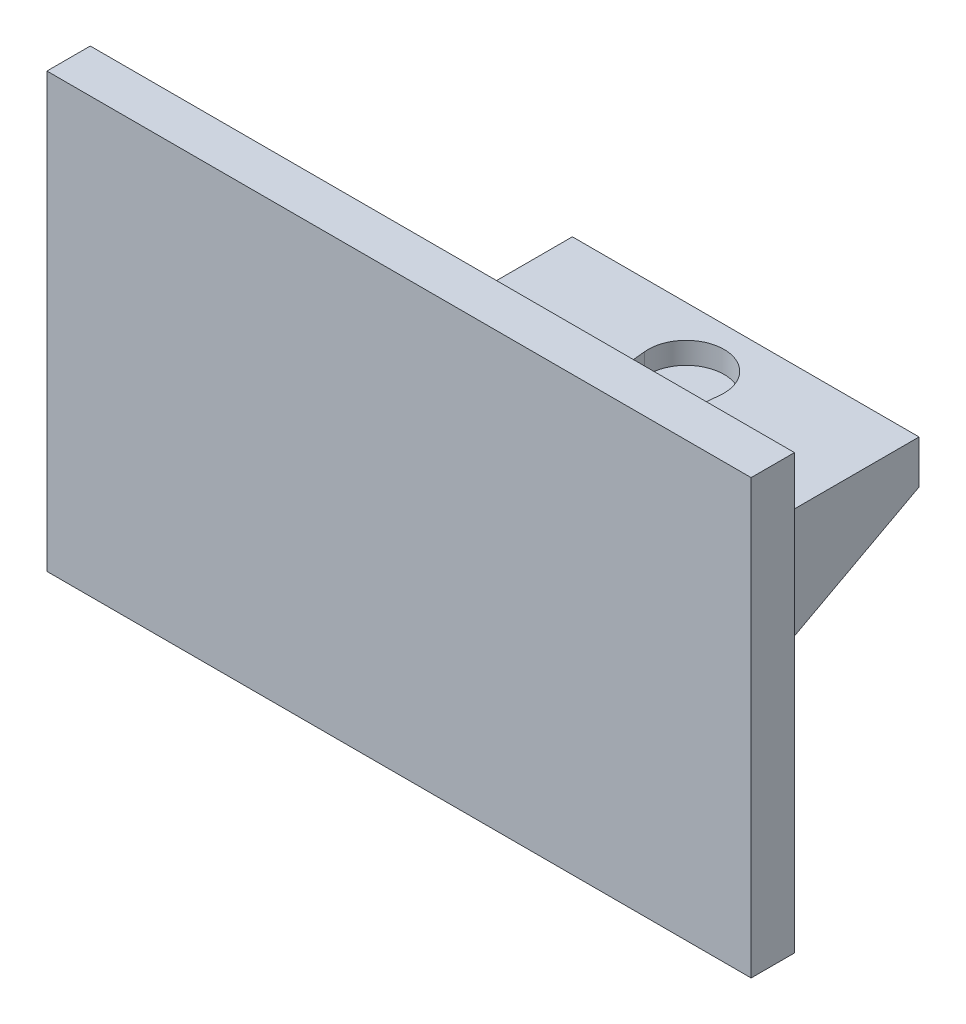
ISO-10303-21;
HEADER;
FILE_DESCRIPTION(('STEP AP214'),'2;1');
FILE_NAME('part.step','',(''),(''),'','','');
FILE_SCHEMA(('AUTOMOTIVE_DESIGN { 1 0 10303 214 1 1 1 1 }'));
ENDSEC;
DATA;
#1=APPLICATION_CONTEXT('core data for automotive mechanical design processes');
#2=APPLICATION_PROTOCOL_DEFINITION('international standard','automotive_design',2000,#1);
#3=PRODUCT_CONTEXT('',#1,'mechanical');
#4=PRODUCT('Part','Part','',(#3));
#5=PRODUCT_RELATED_PRODUCT_CATEGORY('part','',(#4));
#6=PRODUCT_DEFINITION_FORMATION('','',#4);
#7=PRODUCT_DEFINITION_CONTEXT('part definition',#1,'design');
#8=PRODUCT_DEFINITION('design','',#6,#7);
#9=PRODUCT_DEFINITION_SHAPE('','',#8);
#10=(LENGTH_UNIT() NAMED_UNIT(*) SI_UNIT(.MILLI.,.METRE.));
#11=(NAMED_UNIT(*) PLANE_ANGLE_UNIT() SI_UNIT($,.RADIAN.));
#12=(NAMED_UNIT(*) SI_UNIT($,.STERADIAN.) SOLID_ANGLE_UNIT());
#13=UNCERTAINTY_MEASURE_WITH_UNIT(LENGTH_MEASURE(1.E-05),#10,'distance_accuracy_value','');
#14=(GEOMETRIC_REPRESENTATION_CONTEXT(3) GLOBAL_UNCERTAINTY_ASSIGNED_CONTEXT((#13)) GLOBAL_UNIT_ASSIGNED_CONTEXT((#10,
#11,#12)) REPRESENTATION_CONTEXT('',''));
#15=CARTESIAN_POINT('',(0.,0.,0.));
#16=DIRECTION('',(0.,0.,1.));
#17=DIRECTION('',(1.,0.,0.));
#18=AXIS2_PLACEMENT_3D('',#15,#16,#17);
#19=CARTESIAN_POINT('',(0.,4.,4.5));
#20=DIRECTION('',(0.,-1.,0.));
#21=DIRECTION('',(0.,0.,-1.));
#22=AXIS2_PLACEMENT_3D('',#19,#20,#21);
#23=CYLINDRICAL_SURFACE('',#22,2.);
#24=CARTESIAN_POINT('',(0.,2.,4.5));
#25=DIRECTION('',(0.,1.,0.));
#26=DIRECTION('',(0.,0.,1.));
#27=AXIS2_PLACEMENT_3D('',#24,#25,#26);
#28=CIRCLE('',#27,2.);
#29=CARTESIAN_POINT('',(-1.98997487421325,2.,4.70000000000002));
#30=VERTEX_POINT('',#29);
#31=CARTESIAN_POINT('',(1.98997487421324,2.,4.70000000000002));
#32=VERTEX_POINT('',#31);
#33=EDGE_CURVE('E64',#30,#32,#28,.T.);
#34=ORIENTED_EDGE('',*,*,#33,.F.);
#35=DIRECTION('',(0.,-1.,0.));
#36=VECTOR('',#35,1.);
#37=CARTESIAN_POINT('',(-1.98997487421324,4.,4.70000000000002));
#38=LINE('',#37,#36);
#39=CARTESIAN_POINT('',(-1.98997487421324,4.,4.70000000000002));
#40=VERTEX_POINT('',#39);
#41=EDGE_CURVE('E135',#40,#30,#38,.T.);
#42=ORIENTED_EDGE('',*,*,#41,.F.);
#43=CARTESIAN_POINT('',(0.,4.,4.5));
#44=DIRECTION('',(0.,1.,0.));
#45=DIRECTION('',(0.,0.,1.));
#46=AXIS2_PLACEMENT_3D('',#43,#44,#45);
#47=CIRCLE('',#46,2.);
#48=CARTESIAN_POINT('',(1.98997487421324,4.,4.70000000000002));
#49=VERTEX_POINT('',#48);
#50=EDGE_CURVE('E116',#40,#49,#47,.T.);
#51=ORIENTED_EDGE('',*,*,#50,.T.);
#52=DIRECTION('',(0.,-1.,0.));
#53=VECTOR('',#52,1.);
#54=CARTESIAN_POINT('',(1.98997487421324,4.,4.70000000000002));
#55=LINE('',#54,#53);
#56=EDGE_CURVE('E125',#49,#32,#55,.T.);
#57=ORIENTED_EDGE('',*,*,#56,.T.);
#58=EDGE_LOOP('',(#34,#42,#51,#57));
#59=FACE_BOUND('',#58,.T.);
#60=ADVANCED_FACE('F49',(#59),#23,.F.);
#61=CARTESIAN_POINT('',(-2.43771922091122,4.,0.245));
#62=DIRECTION('',(0.99498743710662,0.,-0.1));
#63=DIRECTION('',(-0.1,0.,-0.99498743710662));
#64=AXIS2_PLACEMENT_3D('',#61,#62,#63);
#65=PLANE('',#64);
#66=DIRECTION('',(0.1,0.,0.99498743710662));
#67=VECTOR('',#66,1.);
#68=CARTESIAN_POINT('',(-2.43771922091122,2.,0.245));
#69=LINE('',#68,#67);
#70=CARTESIAN_POINT('',(-3.48245602987318,2.,-10.15));
#71=VERTEX_POINT('',#70);
#72=EDGE_CURVE('E96',#71,#30,#69,.T.);
#73=ORIENTED_EDGE('',*,*,#72,.F.);
#74=DIRECTION('',(0.,-1.,0.));
#75=VECTOR('',#74,1.);
#76=CARTESIAN_POINT('',(-3.48245602987317,4.,-10.15));
#77=LINE('',#76,#75);
#78=CARTESIAN_POINT('',(-3.48245602987317,4.,-10.15));
#79=VERTEX_POINT('',#78);
#80=EDGE_CURVE('E171',#79,#71,#77,.T.);
#81=ORIENTED_EDGE('',*,*,#80,.F.);
#82=DIRECTION('',(0.1,0.,0.99498743710662));
#83=VECTOR('',#82,1.);
#84=CARTESIAN_POINT('',(-2.43771922091122,4.,0.245));
#85=LINE('',#84,#83);
#86=EDGE_CURVE('E137',#79,#40,#85,.T.);
#87=ORIENTED_EDGE('',*,*,#86,.T.);
#88=ORIENTED_EDGE('',*,*,#41,.T.);
#89=EDGE_LOOP('',(#73,#81,#87,#88));
#90=FACE_BOUND('',#89,.T.);
#91=ADVANCED_FACE('F402',(#90),#65,.T.);
#92=CARTESIAN_POINT('',(0.,4.,-10.5));
#93=DIRECTION('',(0.,-1.,0.));
#94=DIRECTION('',(0.,0.,-1.));
#95=AXIS2_PLACEMENT_3D('',#92,#93,#94);
#96=CYLINDRICAL_SURFACE('',#95,3.5);
#97=CARTESIAN_POINT('',(0.,2.,-10.5));
#98=DIRECTION('',(0.,1.,0.));
#99=DIRECTION('',(0.,0.,1.));
#100=AXIS2_PLACEMENT_3D('',#97,#98,#99);
#101=CIRCLE('',#100,3.5);
#102=CARTESIAN_POINT('',(3.48245602987316,2.,-10.15));
#103=VERTEX_POINT('',#102);
#104=EDGE_CURVE('E291',#103,#71,#101,.T.);
#105=ORIENTED_EDGE('',*,*,#104,.F.);
#106=DIRECTION('',(0.,-1.,0.));
#107=VECTOR('',#106,1.);
#108=CARTESIAN_POINT('',(3.48245602987317,4.,-10.15));
#109=LINE('',#108,#107);
#110=CARTESIAN_POINT('',(3.48245602987317,4.,-10.15));
#111=VERTEX_POINT('',#110);
#112=EDGE_CURVE('E130',#111,#103,#109,.T.);
#113=ORIENTED_EDGE('',*,*,#112,.F.);
#114=CARTESIAN_POINT('',(0.,4.,-10.5));
#115=DIRECTION('',(0.,1.,0.));
#116=DIRECTION('',(0.,0.,1.));
#117=AXIS2_PLACEMENT_3D('',#114,#115,#116);
#118=CIRCLE('',#117,3.5);
#119=EDGE_CURVE('E118',#111,#79,#118,.T.);
#120=ORIENTED_EDGE('',*,*,#119,.T.);
#121=ORIENTED_EDGE('',*,*,#80,.T.);
#122=EDGE_LOOP('',(#105,#113,#120,#121));
#123=FACE_BOUND('',#122,.T.);
#124=ADVANCED_FACE('F400',(#123),#96,.F.);
#125=CARTESIAN_POINT('',(2.43771922091122,4.,0.245));
#126=DIRECTION('',(0.99498743710662,0.,0.1));
#127=DIRECTION('',(0.1,0.,-0.99498743710662));
#128=AXIS2_PLACEMENT_3D('',#125,#126,#127);
#129=PLANE('',#128);
#130=ORIENTED_EDGE('',*,*,#112,.T.);
#131=DIRECTION('',(-0.1,0.,0.99498743710662));
#132=VECTOR('',#131,1.);
#133=CARTESIAN_POINT('',(2.43771922091122,2.,0.245));
#134=LINE('',#133,#132);
#135=EDGE_CURVE('E127',#103,#32,#134,.T.);
#136=ORIENTED_EDGE('',*,*,#135,.T.);
#137=ORIENTED_EDGE('',*,*,#56,.F.);
#138=DIRECTION('',(-0.1,0.,0.99498743710662));
#139=VECTOR('',#138,1.);
#140=CARTESIAN_POINT('',(2.43771922091122,4.,0.245));
#141=LINE('',#140,#139);
#142=EDGE_CURVE('E110',#111,#49,#141,.T.);
#143=ORIENTED_EDGE('',*,*,#142,.F.);
#144=EDGE_LOOP('',(#130,#136,#137,#143));
#145=FACE_BOUND('',#144,.T.);
#146=ADVANCED_FACE('F126',(#145),#129,.F.);
#147=CARTESIAN_POINT('',(0.,4.,-16.));
#148=DIRECTION('',(0.,0.,-1.));
#149=DIRECTION('',(-1.,0.,0.));
#150=AXIS2_PLACEMENT_3D('',#147,#148,#149);
#151=PLANE('',#150);
#152=DIRECTION('',(-1.,0.,0.));
#153=VECTOR('',#152,1.);
#154=CARTESIAN_POINT('',(32.5,0.,-16.));
#155=LINE('',#154,#153);
#156=CARTESIAN_POINT('',(-12.,0.,-16.));
#157=VERTEX_POINT('',#156);
#158=CARTESIAN_POINT('',(-16.,0.,-16.));
#159=VERTEX_POINT('',#158);
#160=EDGE_CURVE('E478',#157,#159,#155,.T.);
#161=ORIENTED_EDGE('',*,*,#160,.T.);
#162=DIRECTION('',(0.,1.,0.));
#163=VECTOR('',#162,1.);
#164=CARTESIAN_POINT('',(-16.,-15.,-16.));
#165=LINE('',#164,#163);
#166=CARTESIAN_POINT('',(-16.,4.,-16.));
#167=VERTEX_POINT('',#166);
#168=EDGE_CURVE('E272',#159,#167,#165,.T.);
#169=ORIENTED_EDGE('',*,*,#168,.T.);
#170=DIRECTION('',(1.,0.,0.));
#171=VECTOR('',#170,1.);
#172=CARTESIAN_POINT('',(0.,4.,-16.));
#173=LINE('',#172,#171);
#174=CARTESIAN_POINT('',(16.,4.,-16.));
#175=VERTEX_POINT('',#174);
#176=EDGE_CURVE('E131',#167,#175,#173,.T.);
#177=ORIENTED_EDGE('',*,*,#176,.T.);
#178=DIRECTION('',(0.,1.,0.));
#179=VECTOR('',#178,1.);
#180=CARTESIAN_POINT('',(16.,-15.,-16.));
#181=LINE('',#180,#179);
#182=CARTESIAN_POINT('',(16.,0.,-16.));
#183=VERTEX_POINT('',#182);
#184=EDGE_CURVE('E234',#183,#175,#181,.T.);
#185=ORIENTED_EDGE('',*,*,#184,.F.);
#186=CARTESIAN_POINT('',(12.,0.,-16.));
#187=VERTEX_POINT('',#186);
#188=EDGE_CURVE('E483',#183,#187,#155,.T.);
#189=ORIENTED_EDGE('',*,*,#188,.T.);
#190=DIRECTION('',(1.,0.,0.));
#191=VECTOR('',#190,1.);
#192=CARTESIAN_POINT('',(0.,0.,-16.));
#193=LINE('',#192,#191);
#194=EDGE_CURVE('E138',#157,#187,#193,.T.);
#195=ORIENTED_EDGE('',*,*,#194,.F.);
#196=EDGE_LOOP('',(#161,#169,#177,#185,#189,#195));
#197=FACE_BOUND('',#196,.T.);
#198=ADVANCED_FACE('F413',(#197),#151,.T.);
#199=CARTESIAN_POINT('',(0.,4.,0.));
#200=DIRECTION('',(0.,1.,0.));
#201=DIRECTION('',(0.,0.,1.));
#202=AXIS2_PLACEMENT_3D('',#199,#200,#201);
#203=PLANE('',#202);
#204=ORIENTED_EDGE('',*,*,#50,.F.);
#205=ORIENTED_EDGE('',*,*,#86,.F.);
#206=ORIENTED_EDGE('',*,*,#119,.F.);
#207=ORIENTED_EDGE('',*,*,#142,.T.);
#208=EDGE_LOOP('',(#204,#205,#206,#207));
#209=FACE_BOUND('',#208,.T.);
#210=DIRECTION('',(-1.,0.,0.));
#211=VECTOR('',#210,1.);
#212=CARTESIAN_POINT('',(32.5,4.,4.50000000000002));
#213=LINE('',#212,#211);
#214=CARTESIAN_POINT('',(-12.,4.,4.50000000000002));
#215=VERTEX_POINT('',#214);
#216=CARTESIAN_POINT('',(-16.,4.,4.50000000000002));
#217=VERTEX_POINT('',#216);
#218=EDGE_CURVE('E529',#215,#217,#213,.T.);
#219=ORIENTED_EDGE('',*,*,#218,.F.);
#220=DIRECTION('',(0.,0.,1.));
#221=VECTOR('',#220,1.);
#222=CARTESIAN_POINT('',(-12.,4.,0.));
#223=LINE('',#222,#221);
#224=CARTESIAN_POINT('',(-12.,4.,12.));
#225=VERTEX_POINT('',#224);
#226=EDGE_CURVE('E122',#215,#225,#223,.T.);
#227=ORIENTED_EDGE('',*,*,#226,.T.);
#228=DIRECTION('',(1.,0.,0.));
#229=VECTOR('',#228,1.);
#230=CARTESIAN_POINT('',(0.,4.,12.));
#231=LINE('',#230,#229);
#232=CARTESIAN_POINT('',(12.,4.,12.));
#233=VERTEX_POINT('',#232);
#234=EDGE_CURVE('E154',#225,#233,#231,.T.);
#235=ORIENTED_EDGE('',*,*,#234,.T.);
#236=DIRECTION('',(0.,0.,1.));
#237=VECTOR('',#236,1.);
#238=CARTESIAN_POINT('',(12.,4.,0.));
#239=LINE('',#238,#237);
#240=CARTESIAN_POINT('',(12.,4.,4.50000000000002));
#241=VERTEX_POINT('',#240);
#242=EDGE_CURVE('E73',#241,#233,#239,.T.);
#243=ORIENTED_EDGE('',*,*,#242,.F.);
#244=CARTESIAN_POINT('',(16.,4.,4.50000000000002));
#245=VERTEX_POINT('',#244);
#246=EDGE_CURVE('E475',#245,#241,#213,.T.);
#247=ORIENTED_EDGE('',*,*,#246,.F.);
#248=DIRECTION('',(0.,0.,1.));
#249=VECTOR('',#248,1.);
#250=CARTESIAN_POINT('',(16.,4.,0.));
#251=LINE('',#250,#249);
#252=EDGE_CURVE('E527',#175,#245,#251,.T.);
#253=ORIENTED_EDGE('',*,*,#252,.F.);
#254=ORIENTED_EDGE('',*,*,#176,.F.);
#255=DIRECTION('',(0.,0.,1.));
#256=VECTOR('',#255,1.);
#257=CARTESIAN_POINT('',(-16.,4.,0.));
#258=LINE('',#257,#256);
#259=EDGE_CURVE('E514',#167,#217,#258,.T.);
#260=ORIENTED_EDGE('',*,*,#259,.T.);
#261=EDGE_LOOP('',(#219,#227,#235,#243,#247,#253,#254,#260));
#262=FACE_BOUND('',#261,.T.);
#263=ADVANCED_FACE('F112',(#209,#262),#203,.T.);
#264=CARTESIAN_POINT('',(0.,0.,0.));
#265=DIRECTION('',(0.,1.,0.));
#266=DIRECTION('',(0.,0.,1.));
#267=AXIS2_PLACEMENT_3D('',#264,#265,#266);
#268=PLANE('',#267);
#269=DIRECTION('',(0.,0.,1.));
#270=VECTOR('',#269,1.);
#271=CARTESIAN_POINT('',(-12.,0.,0.));
#272=LINE('',#271,#270);
#273=CARTESIAN_POINT('',(-12.,0.,12.));
#274=VERTEX_POINT('',#273);
#275=EDGE_CURVE('E162',#157,#274,#272,.T.);
#276=ORIENTED_EDGE('',*,*,#275,.F.);
#277=ORIENTED_EDGE('',*,*,#194,.T.);
#278=DIRECTION('',(0.,0.,1.));
#279=VECTOR('',#278,1.);
#280=CARTESIAN_POINT('',(12.,0.,0.));
#281=LINE('',#280,#279);
#282=CARTESIAN_POINT('',(12.,0.,12.));
#283=VERTEX_POINT('',#282);
#284=EDGE_CURVE('E144',#187,#283,#281,.T.);
#285=ORIENTED_EDGE('',*,*,#284,.T.);
#286=DIRECTION('',(1.,0.,0.));
#287=VECTOR('',#286,1.);
#288=CARTESIAN_POINT('',(0.,0.,12.));
#289=LINE('',#288,#287);
#290=EDGE_CURVE('E87',#274,#283,#289,.T.);
#291=ORIENTED_EDGE('',*,*,#290,.F.);
#292=EDGE_LOOP('',(#276,#277,#285,#291));
#293=FACE_BOUND('',#292,.T.);
#294=CARTESIAN_POINT('',(0.,0.,2.5));
#295=DIRECTION('',(0.,1.,0.));
#296=DIRECTION('',(0.,0.,1.));
#297=AXIS2_PLACEMENT_3D('',#294,#295,#296);
#298=CIRCLE('',#297,0.5);
#299=CARTESIAN_POINT('',(0.,0.,3.));
#300=VERTEX_POINT('',#299);
#301=EDGE_CURVE('E147',#300,#300,#298,.T.);
#302=ORIENTED_EDGE('',*,*,#301,.T.);
#303=EDGE_LOOP('',(#302));
#304=FACE_BOUND('',#303,.T.);
#305=ADVANCED_FACE('F417',(#293,#304),#268,.F.);
#306=CARTESIAN_POINT('',(0.,2.,2.5));
#307=DIRECTION('',(0.,-1.,0.));
#308=DIRECTION('',(0.,0.,-1.));
#309=AXIS2_PLACEMENT_3D('',#306,#307,#308);
#310=CYLINDRICAL_SURFACE('',#309,0.5);
#311=CARTESIAN_POINT('',(0.,2.,2.5));
#312=DIRECTION('',(0.,1.,0.));
#313=DIRECTION('',(0.,0.,1.));
#314=AXIS2_PLACEMENT_3D('',#311,#312,#313);
#315=CIRCLE('',#314,0.5);
#316=CARTESIAN_POINT('',(0.,2.,3.));
#317=VERTEX_POINT('',#316);
#318=EDGE_CURVE('E283',#317,#317,#315,.T.);
#319=ORIENTED_EDGE('',*,*,#318,.T.);
#320=EDGE_LOOP('',(#319));
#321=FACE_BOUND('',#320,.T.);
#322=ORIENTED_EDGE('',*,*,#301,.F.);
#323=EDGE_LOOP('',(#322));
#324=FACE_BOUND('',#323,.T.);
#325=ADVANCED_FACE('F420',(#321,#324),#310,.F.);
#326=CARTESIAN_POINT('',(0.,2.,0.));
#327=DIRECTION('',(0.,1.,0.));
#328=DIRECTION('',(0.,0.,1.));
#329=AXIS2_PLACEMENT_3D('',#326,#327,#328);
#330=PLANE('',#329);
#331=ORIENTED_EDGE('',*,*,#318,.F.);
#332=EDGE_LOOP('',(#331));
#333=FACE_BOUND('',#332,.T.);
#334=ORIENTED_EDGE('',*,*,#33,.T.);
#335=ORIENTED_EDGE('',*,*,#135,.F.);
#336=ORIENTED_EDGE('',*,*,#104,.T.);
#337=ORIENTED_EDGE('',*,*,#72,.T.);
#338=EDGE_LOOP('',(#334,#335,#336,#337));
#339=FACE_BOUND('',#338,.T.);
#340=ADVANCED_FACE('F398',(#333,#339),#330,.T.);
#341=CARTESIAN_POINT('',(12.,-15.,0.));
#342=DIRECTION('',(-1.,0.,0.));
#343=DIRECTION('',(0.,0.,1.));
#344=AXIS2_PLACEMENT_3D('',#341,#342,#343);
#345=PLANE('',#344);
#346=DIRECTION('',(0.,0.472221412515419,-0.881479970028782));
#347=VECTOR('',#346,1.);
#348=CARTESIAN_POINT('',(12.,-10.0049554013875,2.67591674925669));
#349=LINE('',#348,#347);
#350=CARTESIAN_POINT('',(12.,-15.,12.));
#351=VERTEX_POINT('',#350);
#352=EDGE_CURVE('E316',#351,#187,#349,.T.);
#353=ORIENTED_EDGE('',*,*,#352,.F.);
#354=DIRECTION('',(0.,1.,0.));
#355=VECTOR('',#354,1.);
#356=CARTESIAN_POINT('',(12.,-15.,12.));
#357=LINE('',#356,#355);
#358=EDGE_CURVE('E246',#351,#283,#357,.T.);
#359=ORIENTED_EDGE('',*,*,#358,.T.);
#360=ORIENTED_EDGE('',*,*,#284,.F.);
#361=EDGE_LOOP('',(#353,#359,#360));
#362=FACE_BOUND('',#361,.T.);
#363=ADVANCED_FACE('F428',(#362),#345,.T.);
#364=CARTESIAN_POINT('',(-12.,-15.,0.));
#365=DIRECTION('',(-1.,0.,0.));
#366=DIRECTION('',(0.,0.,1.));
#367=AXIS2_PLACEMENT_3D('',#364,#365,#366);
#368=PLANE('',#367);
#369=DIRECTION('',(0.,1.,0.));
#370=VECTOR('',#369,1.);
#371=CARTESIAN_POINT('',(-12.,-15.,12.));
#372=LINE('',#371,#370);
#373=CARTESIAN_POINT('',(-12.,-15.,12.));
#374=VERTEX_POINT('',#373);
#375=EDGE_CURVE('E276',#374,#274,#372,.T.);
#376=ORIENTED_EDGE('',*,*,#375,.F.);
#377=DIRECTION('',(0.,0.472221412515419,-0.881479970028782));
#378=VECTOR('',#377,1.);
#379=CARTESIAN_POINT('',(-12.,-10.0049554013875,2.67591674925669));
#380=LINE('',#379,#378);
#381=EDGE_CURVE('E323',#374,#157,#380,.T.);
#382=ORIENTED_EDGE('',*,*,#381,.T.);
#383=ORIENTED_EDGE('',*,*,#275,.T.);
#384=EDGE_LOOP('',(#376,#382,#383));
#385=FACE_BOUND('',#384,.T.);
#386=ADVANCED_FACE('F440',(#385),#368,.F.);
#387=CARTESIAN_POINT('',(0.,-15.,12.));
#388=DIRECTION('',(0.,0.,1.));
#389=DIRECTION('',(1.,0.,0.));
#390=AXIS2_PLACEMENT_3D('',#387,#388,#389);
#391=PLANE('',#390);
#392=ORIENTED_EDGE('',*,*,#375,.T.);
#393=ORIENTED_EDGE('',*,*,#290,.T.);
#394=ORIENTED_EDGE('',*,*,#358,.F.);
#395=DIRECTION('',(1.,0.,0.));
#396=VECTOR('',#395,1.);
#397=CARTESIAN_POINT('',(0.,-15.,12.));
#398=LINE('',#397,#396);
#399=EDGE_CURVE('E211',#374,#351,#398,.T.);
#400=ORIENTED_EDGE('',*,*,#399,.F.);
#401=EDGE_LOOP('',(#392,#393,#394,#400));
#402=FACE_BOUND('',#401,.T.);
#403=ADVANCED_FACE('F433',(#402),#391,.F.);
#404=DIRECTION('',(0.,0.941741911594837,0.336336396998156));
#405=VECTOR('',#404,1.);
#406=CARTESIAN_POINT('',(12.,-14.2760180995475,-2.02714932126695));
#407=LINE('',#406,#405);
#408=CARTESIAN_POINT('',(12.,25.,12.));
#409=VERTEX_POINT('',#408);
#410=EDGE_CURVE('E472',#241,#409,#407,.T.);
#411=ORIENTED_EDGE('',*,*,#410,.F.);
#412=ORIENTED_EDGE('',*,*,#242,.T.);
#413=EDGE_CURVE('E241',#233,#409,#357,.T.);
#414=ORIENTED_EDGE('',*,*,#413,.T.);
#415=EDGE_LOOP('',(#411,#412,#414));
#416=FACE_BOUND('',#415,.T.);
#417=ADVANCED_FACE('F430',(#416),#345,.T.);
#418=CARTESIAN_POINT('',(16.,-15.,0.));
#419=DIRECTION('',(-1.,0.,0.));
#420=DIRECTION('',(0.,0.,1.));
#421=AXIS2_PLACEMENT_3D('',#418,#419,#420);
#422=PLANE('',#421);
#423=ORIENTED_EDGE('',*,*,#252,.T.);
#424=DIRECTION('',(0.,0.941741911594837,0.336336396998156));
#425=VECTOR('',#424,1.);
#426=CARTESIAN_POINT('',(16.,-14.2760180995475,-2.02714932126695));
#427=LINE('',#426,#425);
#428=CARTESIAN_POINT('',(16.,25.,12.));
#429=VERTEX_POINT('',#428);
#430=EDGE_CURVE('E229',#245,#429,#427,.T.);
#431=ORIENTED_EDGE('',*,*,#430,.T.);
#432=DIRECTION('',(0.,1.,0.));
#433=VECTOR('',#432,1.);
#434=CARTESIAN_POINT('',(16.,-15.,12.));
#435=LINE('',#434,#433);
#436=CARTESIAN_POINT('',(16.,-15.,12.));
#437=VERTEX_POINT('',#436);
#438=EDGE_CURVE('E222',#437,#429,#435,.T.);
#439=ORIENTED_EDGE('',*,*,#438,.F.);
#440=DIRECTION('',(0.,0.472221412515419,-0.881479970028782));
#441=VECTOR('',#440,1.);
#442=CARTESIAN_POINT('',(16.,-10.0049554013875,2.67591674925669));
#443=LINE('',#442,#441);
#444=EDGE_CURVE('E227',#437,#183,#443,.T.);
#445=ORIENTED_EDGE('',*,*,#444,.T.);
#446=ORIENTED_EDGE('',*,*,#184,.T.);
#447=EDGE_LOOP('',(#423,#431,#439,#445,#446));
#448=FACE_BOUND('',#447,.T.);
#449=ADVANCED_FACE('F224',(#448),#422,.F.);
#450=CARTESIAN_POINT('',(0.,-15.,12.));
#451=DIRECTION('',(0.,0.,1.));
#452=DIRECTION('',(1.,0.,0.));
#453=AXIS2_PLACEMENT_3D('',#450,#451,#452);
#454=PLANE('',#453);
#455=ORIENTED_EDGE('',*,*,#438,.T.);
#456=DIRECTION('',(1.,0.,0.));
#457=VECTOR('',#456,1.);
#458=CARTESIAN_POINT('',(0.,25.,12.));
#459=LINE('',#458,#457);
#460=CARTESIAN_POINT('',(32.5,25.,12.));
#461=VERTEX_POINT('',#460);
#462=EDGE_CURVE('E338',#429,#461,#459,.T.);
#463=ORIENTED_EDGE('',*,*,#462,.T.);
#464=DIRECTION('',(0.,1.,0.));
#465=VECTOR('',#464,1.);
#466=CARTESIAN_POINT('',(32.5,-15.,12.));
#467=LINE('',#466,#465);
#468=CARTESIAN_POINT('',(32.5,-15.,12.));
#469=VERTEX_POINT('',#468);
#470=EDGE_CURVE('E235',#469,#461,#467,.T.);
#471=ORIENTED_EDGE('',*,*,#470,.F.);
#472=DIRECTION('',(1.,0.,0.));
#473=VECTOR('',#472,1.);
#474=CARTESIAN_POINT('',(0.,-15.,12.));
#475=LINE('',#474,#473);
#476=EDGE_CURVE('E207',#437,#469,#475,.T.);
#477=ORIENTED_EDGE('',*,*,#476,.F.);
#478=EDGE_LOOP('',(#455,#463,#471,#477));
#479=FACE_BOUND('',#478,.T.);
#480=ADVANCED_FACE('F237',(#479),#454,.F.);
#481=CARTESIAN_POINT('',(32.5,-15.,0.));
#482=DIRECTION('',(-1.,0.,0.));
#483=DIRECTION('',(0.,0.,1.));
#484=AXIS2_PLACEMENT_3D('',#481,#482,#483);
#485=PLANE('',#484);
#486=ORIENTED_EDGE('',*,*,#470,.T.);
#487=DIRECTION('',(0.,0.,1.));
#488=VECTOR('',#487,1.);
#489=CARTESIAN_POINT('',(32.5,25.,0.));
#490=LINE('',#489,#488);
#491=CARTESIAN_POINT('',(32.5,25.,16.));
#492=VERTEX_POINT('',#491);
#493=EDGE_CURVE('E334',#461,#492,#490,.T.);
#494=ORIENTED_EDGE('',*,*,#493,.T.);
#495=DIRECTION('',(0.,1.,0.));
#496=VECTOR('',#495,1.);
#497=CARTESIAN_POINT('',(32.5,-15.,16.));
#498=LINE('',#497,#496);
#499=CARTESIAN_POINT('',(32.5,-15.,16.));
#500=VERTEX_POINT('',#499);
#501=EDGE_CURVE('E256',#500,#492,#498,.T.);
#502=ORIENTED_EDGE('',*,*,#501,.F.);
#503=DIRECTION('',(0.,0.,1.));
#504=VECTOR('',#503,1.);
#505=CARTESIAN_POINT('',(32.5,-15.,0.));
#506=LINE('',#505,#504);
#507=EDGE_CURVE('E242',#469,#500,#506,.T.);
#508=ORIENTED_EDGE('',*,*,#507,.F.);
#509=EDGE_LOOP('',(#486,#494,#502,#508));
#510=FACE_BOUND('',#509,.T.);
#511=ADVANCED_FACE('F450',(#510),#485,.F.);
#512=CARTESIAN_POINT('',(0.,-15.,16.));
#513=DIRECTION('',(0.,0.,1.));
#514=DIRECTION('',(1.,0.,0.));
#515=AXIS2_PLACEMENT_3D('',#512,#513,#514);
#516=PLANE('',#515);
#517=ORIENTED_EDGE('',*,*,#501,.T.);
#518=DIRECTION('',(1.,0.,0.));
#519=VECTOR('',#518,1.);
#520=CARTESIAN_POINT('',(0.,25.,16.));
#521=LINE('',#520,#519);
#522=CARTESIAN_POINT('',(-32.5,25.,16.));
#523=VERTEX_POINT('',#522);
#524=EDGE_CURVE('E330',#523,#492,#521,.T.);
#525=ORIENTED_EDGE('',*,*,#524,.F.);
#526=DIRECTION('',(0.,1.,0.));
#527=VECTOR('',#526,1.);
#528=CARTESIAN_POINT('',(-32.5,-15.,16.));
#529=LINE('',#528,#527);
#530=CARTESIAN_POINT('',(-32.5,-15.,16.));
#531=VERTEX_POINT('',#530);
#532=EDGE_CURVE('E260',#531,#523,#529,.T.);
#533=ORIENTED_EDGE('',*,*,#532,.F.);
#534=DIRECTION('',(1.,0.,0.));
#535=VECTOR('',#534,1.);
#536=CARTESIAN_POINT('',(0.,-15.,16.));
#537=LINE('',#536,#535);
#538=EDGE_CURVE('E248',#531,#500,#537,.T.);
#539=ORIENTED_EDGE('',*,*,#538,.T.);
#540=EDGE_LOOP('',(#517,#525,#533,#539));
#541=FACE_BOUND('',#540,.T.);
#542=ADVANCED_FACE('F355',(#541),#516,.T.);
#543=CARTESIAN_POINT('',(-32.5,-15.,0.));
#544=DIRECTION('',(-1.,0.,0.));
#545=DIRECTION('',(0.,0.,1.));
#546=AXIS2_PLACEMENT_3D('',#543,#544,#545);
#547=PLANE('',#546);
#548=ORIENTED_EDGE('',*,*,#532,.T.);
#549=DIRECTION('',(0.,0.,1.));
#550=VECTOR('',#549,1.);
#551=CARTESIAN_POINT('',(-32.5,25.,0.));
#552=LINE('',#551,#550);
#553=CARTESIAN_POINT('',(-32.5,25.,12.));
#554=VERTEX_POINT('',#553);
#555=EDGE_CURVE('E321',#554,#523,#552,.T.);
#556=ORIENTED_EDGE('',*,*,#555,.F.);
#557=DIRECTION('',(0.,1.,0.));
#558=VECTOR('',#557,1.);
#559=CARTESIAN_POINT('',(-32.5,-15.,12.));
#560=LINE('',#559,#558);
#561=CARTESIAN_POINT('',(-32.5,-15.,12.));
#562=VERTEX_POINT('',#561);
#563=EDGE_CURVE('E264',#562,#554,#560,.T.);
#564=ORIENTED_EDGE('',*,*,#563,.F.);
#565=DIRECTION('',(0.,0.,1.));
#566=VECTOR('',#565,1.);
#567=CARTESIAN_POINT('',(-32.5,-15.,0.));
#568=LINE('',#567,#566);
#569=EDGE_CURVE('E346',#562,#531,#568,.T.);
#570=ORIENTED_EDGE('',*,*,#569,.T.);
#571=EDGE_LOOP('',(#548,#556,#564,#570));
#572=FACE_BOUND('',#571,.T.);
#573=ADVANCED_FACE('F366',(#572),#547,.T.);
#574=CARTESIAN_POINT('',(0.,-15.,12.));
#575=DIRECTION('',(0.,0.,1.));
#576=DIRECTION('',(1.,0.,0.));
#577=AXIS2_PLACEMENT_3D('',#574,#575,#576);
#578=PLANE('',#577);
#579=ORIENTED_EDGE('',*,*,#563,.T.);
#580=DIRECTION('',(1.,0.,0.));
#581=VECTOR('',#580,1.);
#582=CARTESIAN_POINT('',(0.,25.,12.));
#583=LINE('',#582,#581);
#584=CARTESIAN_POINT('',(-16.,25.,12.));
#585=VERTEX_POINT('',#584);
#586=EDGE_CURVE('E315',#554,#585,#583,.T.);
#587=ORIENTED_EDGE('',*,*,#586,.T.);
#588=DIRECTION('',(0.,1.,0.));
#589=VECTOR('',#588,1.);
#590=CARTESIAN_POINT('',(-16.,-15.,12.));
#591=LINE('',#590,#589);
#592=CARTESIAN_POINT('',(-16.,-15.,12.));
#593=VERTEX_POINT('',#592);
#594=EDGE_CURVE('E268',#593,#585,#591,.T.);
#595=ORIENTED_EDGE('',*,*,#594,.F.);
#596=DIRECTION('',(1.,0.,0.));
#597=VECTOR('',#596,1.);
#598=CARTESIAN_POINT('',(0.,-15.,12.));
#599=LINE('',#598,#597);
#600=EDGE_CURVE('E343',#562,#593,#599,.T.);
#601=ORIENTED_EDGE('',*,*,#600,.F.);
#602=EDGE_LOOP('',(#579,#587,#595,#601));
#603=FACE_BOUND('',#602,.T.);
#604=ADVANCED_FACE('F375',(#603),#578,.F.);
#605=CARTESIAN_POINT('',(-16.,-15.,0.));
#606=DIRECTION('',(-1.,0.,0.));
#607=DIRECTION('',(0.,0.,1.));
#608=AXIS2_PLACEMENT_3D('',#605,#606,#607);
#609=PLANE('',#608);
#610=DIRECTION('',(0.,0.941741911594837,0.336336396998156));
#611=VECTOR('',#610,1.);
#612=CARTESIAN_POINT('',(-16.,-14.2760180995475,-2.02714932126695));
#613=LINE('',#612,#611);
#614=EDGE_CURVE('E485',#217,#585,#613,.T.);
#615=ORIENTED_EDGE('',*,*,#614,.F.);
#616=ORIENTED_EDGE('',*,*,#259,.F.);
#617=ORIENTED_EDGE('',*,*,#168,.F.);
#618=DIRECTION('',(0.,0.472221412515419,-0.881479970028782));
#619=VECTOR('',#618,1.);
#620=CARTESIAN_POINT('',(-16.,-10.0049554013875,2.67591674925669));
#621=LINE('',#620,#619);
#622=EDGE_CURVE('E489',#593,#159,#621,.T.);
#623=ORIENTED_EDGE('',*,*,#622,.F.);
#624=ORIENTED_EDGE('',*,*,#594,.T.);
#625=EDGE_LOOP('',(#615,#616,#617,#623,#624));
#626=FACE_BOUND('',#625,.T.);
#627=ADVANCED_FACE('F439',(#626),#609,.T.);
#628=ORIENTED_EDGE('',*,*,#226,.F.);
#629=DIRECTION('',(0.,0.941741911594837,0.336336396998156));
#630=VECTOR('',#629,1.);
#631=CARTESIAN_POINT('',(-12.,-14.2760180995475,-2.02714932126695));
#632=LINE('',#631,#630);
#633=CARTESIAN_POINT('',(-12.,25.,12.));
#634=VERTEX_POINT('',#633);
#635=EDGE_CURVE('E532',#215,#634,#632,.T.);
#636=ORIENTED_EDGE('',*,*,#635,.T.);
#637=EDGE_CURVE('E279',#225,#634,#372,.T.);
#638=ORIENTED_EDGE('',*,*,#637,.F.);
#639=EDGE_LOOP('',(#628,#636,#638));
#640=FACE_BOUND('',#639,.T.);
#641=ADVANCED_FACE('F436',(#640),#368,.F.);
#642=ORIENTED_EDGE('',*,*,#234,.F.);
#643=ORIENTED_EDGE('',*,*,#637,.T.);
#644=DIRECTION('',(1.,0.,0.));
#645=VECTOR('',#644,1.);
#646=CARTESIAN_POINT('',(0.,25.,12.));
#647=LINE('',#646,#645);
#648=EDGE_CURVE('E306',#634,#409,#647,.T.);
#649=ORIENTED_EDGE('',*,*,#648,.T.);
#650=ORIENTED_EDGE('',*,*,#413,.F.);
#651=EDGE_LOOP('',(#642,#643,#649,#650));
#652=FACE_BOUND('',#651,.T.);
#653=ADVANCED_FACE('F303',(#652),#391,.F.);
#654=CARTESIAN_POINT('',(0.,-15.,0.));
#655=DIRECTION('',(0.,1.,0.));
#656=DIRECTION('',(0.,0.,1.));
#657=AXIS2_PLACEMENT_3D('',#654,#655,#656);
#658=PLANE('',#657);
#659=ORIENTED_EDGE('',*,*,#600,.T.);
#660=DIRECTION('',(1.,0.,0.));
#661=VECTOR('',#660,1.);
#662=CARTESIAN_POINT('',(0.,-15.,12.));
#663=LINE('',#662,#661);
#664=EDGE_CURVE('E11',#593,#374,#663,.T.);
#665=ORIENTED_EDGE('',*,*,#664,.T.);
#666=ORIENTED_EDGE('',*,*,#399,.T.);
#667=EDGE_CURVE('E52',#351,#437,#663,.T.);
#668=ORIENTED_EDGE('',*,*,#667,.T.);
#669=ORIENTED_EDGE('',*,*,#476,.T.);
#670=ORIENTED_EDGE('',*,*,#507,.T.);
#671=ORIENTED_EDGE('',*,*,#538,.F.);
#672=ORIENTED_EDGE('',*,*,#569,.F.);
#673=EDGE_LOOP('',(#659,#665,#666,#668,#669,#670,#671,#672));
#674=FACE_BOUND('',#673,.T.);
#675=ADVANCED_FACE('F203',(#674),#658,.F.);
#676=CARTESIAN_POINT('',(0.,25.,0.));
#677=DIRECTION('',(0.,1.,0.));
#678=DIRECTION('',(0.,0.,1.));
#679=AXIS2_PLACEMENT_3D('',#676,#677,#678);
#680=PLANE('',#679);
#681=DIRECTION('',(1.,0.,0.));
#682=VECTOR('',#681,1.);
#683=CARTESIAN_POINT('',(0.,25.,12.));
#684=LINE('',#683,#682);
#685=EDGE_CURVE('E179',#585,#634,#684,.T.);
#686=ORIENTED_EDGE('',*,*,#685,.F.);
#687=ORIENTED_EDGE('',*,*,#586,.F.);
#688=ORIENTED_EDGE('',*,*,#555,.T.);
#689=ORIENTED_EDGE('',*,*,#524,.T.);
#690=ORIENTED_EDGE('',*,*,#493,.F.);
#691=ORIENTED_EDGE('',*,*,#462,.F.);
#692=EDGE_CURVE('E176',#409,#429,#684,.T.);
#693=ORIENTED_EDGE('',*,*,#692,.F.);
#694=ORIENTED_EDGE('',*,*,#648,.F.);
#695=EDGE_LOOP('',(#686,#687,#688,#689,#690,#691,#693,#694));
#696=FACE_BOUND('',#695,.T.);
#697=ADVANCED_FACE('F312',(#696),#680,.T.);
#698=CARTESIAN_POINT('',(32.5,0.,-16.));
#699=DIRECTION('',(0.,0.881479970028782,0.472221412515419));
#700=DIRECTION('',(0.,-0.472221412515419,0.881479970028782));
#701=AXIS2_PLACEMENT_3D('',#698,#699,#700);
#702=PLANE('',#701);
#703=ORIENTED_EDGE('',*,*,#352,.T.);
#704=ORIENTED_EDGE('',*,*,#188,.F.);
#705=ORIENTED_EDGE('',*,*,#444,.F.);
#706=ORIENTED_EDGE('',*,*,#667,.F.);
#707=EDGE_LOOP('',(#703,#704,#705,#706));
#708=FACE_BOUND('',#707,.T.);
#709=ADVANCED_FACE('F462',(#708),#702,.F.);
#710=ORIENTED_EDGE('',*,*,#664,.F.);
#711=ORIENTED_EDGE('',*,*,#622,.T.);
#712=ORIENTED_EDGE('',*,*,#160,.F.);
#713=ORIENTED_EDGE('',*,*,#381,.F.);
#714=EDGE_LOOP('',(#710,#711,#712,#713));
#715=FACE_BOUND('',#714,.T.);
#716=ADVANCED_FACE('F463',(#715),#702,.F.);
#717=CARTESIAN_POINT('',(32.5,25.,12.));
#718=DIRECTION('',(0.,-0.336336396998156,0.941741911594837));
#719=DIRECTION('',(0.,-0.941741911594837,-0.336336396998156));
#720=AXIS2_PLACEMENT_3D('',#717,#718,#719);
#721=PLANE('',#720);
#722=ORIENTED_EDGE('',*,*,#614,.T.);
#723=ORIENTED_EDGE('',*,*,#685,.T.);
#724=ORIENTED_EDGE('',*,*,#635,.F.);
#725=ORIENTED_EDGE('',*,*,#218,.T.);
#726=EDGE_LOOP('',(#722,#723,#724,#725));
#727=FACE_BOUND('',#726,.T.);
#728=ADVANCED_FACE('F465',(#727),#721,.F.);
#729=ORIENTED_EDGE('',*,*,#410,.T.);
#730=ORIENTED_EDGE('',*,*,#692,.T.);
#731=ORIENTED_EDGE('',*,*,#430,.F.);
#732=ORIENTED_EDGE('',*,*,#246,.T.);
#733=EDGE_LOOP('',(#729,#730,#731,#732));
#734=FACE_BOUND('',#733,.T.);
#735=ADVANCED_FACE('F466',(#734),#721,.F.);
#736=CLOSED_SHELL('',(#60,#91,#124,#146,#198,#263,#305,#325,#340,#363,#386,#403,#417,#449,#480,
#511,#542,#573,#604,#627,#641,#653,#675,#697,#709,#716,#728,#735));
#737=MANIFOLD_SOLID_BREP('B2',#736);
#738=ADVANCED_BREP_SHAPE_REPRESENTATION('',(#18,#737),#14);
#739=SHAPE_DEFINITION_REPRESENTATION(#9,#738);
ENDSEC;
END-ISO-10303-21;
